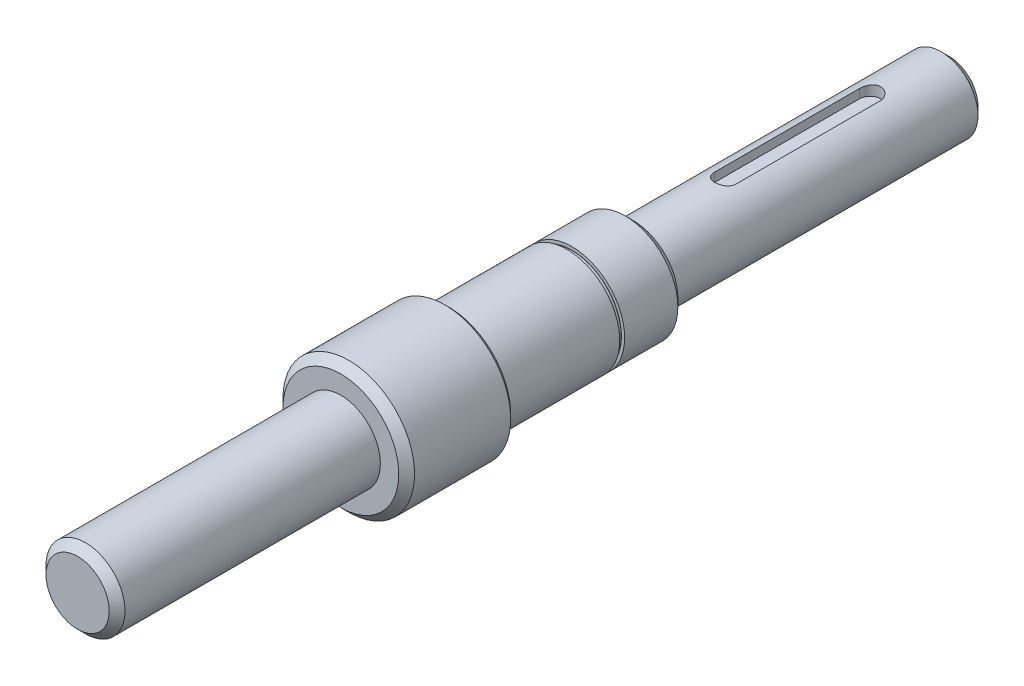
ISO-10303-21;
HEADER;
FILE_DESCRIPTION(('STEP AP214'),'2;1');
FILE_NAME('part.step','',(''),(''),'','','');
FILE_SCHEMA(('AUTOMOTIVE_DESIGN { 1 0 10303 214 1 1 1 1 }'));
ENDSEC;
DATA;
#1=APPLICATION_CONTEXT('core data for automotive mechanical design processes');
#2=APPLICATION_PROTOCOL_DEFINITION('international standard','automotive_design',2000,#1);
#3=PRODUCT_CONTEXT('',#1,'mechanical');
#4=PRODUCT('Part','Part','',(#3));
#5=PRODUCT_RELATED_PRODUCT_CATEGORY('part','',(#4));
#6=PRODUCT_DEFINITION_FORMATION('','',#4);
#7=PRODUCT_DEFINITION_CONTEXT('part definition',#1,'design');
#8=PRODUCT_DEFINITION('design','',#6,#7);
#9=PRODUCT_DEFINITION_SHAPE('','',#8);
#10=(LENGTH_UNIT() NAMED_UNIT(*) SI_UNIT(.MILLI.,.METRE.));
#11=(NAMED_UNIT(*) PLANE_ANGLE_UNIT() SI_UNIT($,.RADIAN.));
#12=(NAMED_UNIT(*) SI_UNIT($,.STERADIAN.) SOLID_ANGLE_UNIT());
#13=UNCERTAINTY_MEASURE_WITH_UNIT(LENGTH_MEASURE(1.E-05),#10,'distance_accuracy_value','');
#14=(GEOMETRIC_REPRESENTATION_CONTEXT(3) GLOBAL_UNCERTAINTY_ASSIGNED_CONTEXT((#13)) GLOBAL_UNIT_ASSIGNED_CONTEXT((#10,
#11,#12)) REPRESENTATION_CONTEXT('',''));
#15=CARTESIAN_POINT('',(0.,0.,0.));
#16=DIRECTION('',(0.,0.,1.));
#17=DIRECTION('',(1.,0.,0.));
#18=AXIS2_PLACEMENT_3D('',#15,#16,#17);
#19=CARTESIAN_POINT('',(0.,0.,0.));
#20=DIRECTION('',(0.,0.,1.));
#21=DIRECTION('',(1.,0.,0.));
#22=AXIS2_PLACEMENT_3D('',#19,#20,#21);
#23=CYLINDRICAL_SURFACE('',#22,20.);
#24=CARTESIAN_POINT('',(-8.88178419700125E-13,0.,-185.925000000001));
#25=DIRECTION('',(0.,0.,-1.));
#26=DIRECTION('',(-1.,0.,0.));
#27=AXIS2_PLACEMENT_3D('',#24,#25,#26);
#28=CIRCLE('',#27,20.);
#29=CARTESIAN_POINT('',(-20.0000000000009,0.,-185.925000000001));
#30=VERTEX_POINT('',#29);
#31=EDGE_CURVE('E130',#30,#30,#28,.T.);
#32=ORIENTED_EDGE('',*,*,#31,.F.);
#33=EDGE_LOOP('',(#32));
#34=FACE_BOUND('',#33,.T.);
#35=CARTESIAN_POINT('',(0.,0.,-141.));
#36=DIRECTION('',(0.,0.,-1.));
#37=DIRECTION('',(-1.,0.,0.));
#38=AXIS2_PLACEMENT_3D('',#35,#36,#37);
#39=CIRCLE('',#38,20.);
#40=CARTESIAN_POINT('',(-20.,0.,-141.));
#41=VERTEX_POINT('',#40);
#42=EDGE_CURVE('E112',#41,#41,#39,.T.);
#43=ORIENTED_EDGE('',*,*,#42,.T.);
#44=EDGE_LOOP('',(#43));
#45=FACE_BOUND('',#44,.T.);
#46=ADVANCED_FACE('F49',(#34,#45),#23,.T.);
#47=CARTESIAN_POINT('',(-8.88178419700125E-13,0.,-185.925000000001));
#48=DIRECTION('',(0.,0.,-1.));
#49=DIRECTION('',(-1.,0.,0.));
#50=AXIS2_PLACEMENT_3D('',#47,#48,#49);
#51=PLANE('',#50);
#52=CARTESIAN_POINT('',(-8.88178419700125E-13,0.,-185.925000000001));
#53=DIRECTION('',(0.,0.,-1.));
#54=DIRECTION('',(-1.,0.,0.));
#55=AXIS2_PLACEMENT_3D('',#52,#53,#54);
#56=CIRCLE('',#55,18.8);
#57=CARTESIAN_POINT('',(-18.8000000000009,0.,-185.925000000001));
#58=VERTEX_POINT('',#57);
#59=EDGE_CURVE('E162',#58,#58,#56,.F.);
#60=ORIENTED_EDGE('',*,*,#59,.T.);
#61=EDGE_LOOP('',(#60));
#62=FACE_BOUND('',#61,.T.);
#63=ORIENTED_EDGE('',*,*,#31,.T.);
#64=EDGE_LOOP('',(#63));
#65=FACE_BOUND('',#64,.T.);
#66=ADVANCED_FACE('F249',(#62,#65),#51,.T.);
#67=CARTESIAN_POINT('',(-4.44089209850063E-13,0.,-187.775));
#68=DIRECTION('',(0.,0.,-1.));
#69=DIRECTION('',(-1.,0.,0.));
#70=AXIS2_PLACEMENT_3D('',#67,#68,#69);
#71=PLANE('',#70);
#72=CARTESIAN_POINT('',(-4.44089209850063E-13,0.,-187.775));
#73=DIRECTION('',(0.,0.,-1.));
#74=DIRECTION('',(-1.,0.,0.));
#75=AXIS2_PLACEMENT_3D('',#72,#73,#74);
#76=CIRCLE('',#75,18.8);
#77=CARTESIAN_POINT('',(-18.8000000000004,0.,-187.775));
#78=VERTEX_POINT('',#77);
#79=EDGE_CURVE('E168',#78,#78,#76,.T.);
#80=ORIENTED_EDGE('',*,*,#79,.T.);
#81=EDGE_LOOP('',(#80));
#82=FACE_BOUND('',#81,.T.);
#83=CARTESIAN_POINT('',(-4.44089209850063E-13,0.,-187.775));
#84=DIRECTION('',(0.,0.,-1.));
#85=DIRECTION('',(-1.,0.,0.));
#86=AXIS2_PLACEMENT_3D('',#83,#84,#85);
#87=CIRCLE('',#86,20.);
#88=CARTESIAN_POINT('',(-20.0000000000004,0.,-187.775));
#89=VERTEX_POINT('',#88);
#90=EDGE_CURVE('E123',#89,#89,#87,.T.);
#91=ORIENTED_EDGE('',*,*,#90,.F.);
#92=EDGE_LOOP('',(#91));
#93=FACE_BOUND('',#92,.T.);
#94=ADVANCED_FACE('F257',(#82,#93),#71,.F.);
#95=CARTESIAN_POINT('',(-8.88178419700125E-13,0.,-185.925000000001));
#96=DIRECTION('',(0.,0.,-1.));
#97=DIRECTION('',(-1.,0.,0.));
#98=AXIS2_PLACEMENT_3D('',#95,#96,#97);
#99=CYLINDRICAL_SURFACE('',#98,18.75);
#100=CARTESIAN_POINT('',(0.,0.,-185.975));
#101=DIRECTION('',(0.,0.,-1.));
#102=DIRECTION('',(-1.,0.,0.));
#103=AXIS2_PLACEMENT_3D('',#100,#101,#102);
#104=CIRCLE('',#103,18.75);
#105=CARTESIAN_POINT('',(-18.75,0.,-185.975));
#106=VERTEX_POINT('',#105);
#107=EDGE_CURVE('E158',#106,#106,#104,.T.);
#108=ORIENTED_EDGE('',*,*,#107,.T.);
#109=EDGE_LOOP('',(#108));
#110=FACE_BOUND('',#109,.T.);
#111=CARTESIAN_POINT('',(-1.33226762955019E-12,0.,-187.725));
#112=DIRECTION('',(0.,0.,-1.));
#113=DIRECTION('',(-1.,0.,0.));
#114=AXIS2_PLACEMENT_3D('',#111,#112,#113);
#115=CIRCLE('',#114,18.75);
#116=CARTESIAN_POINT('',(-18.7500000000013,0.,-187.725));
#117=VERTEX_POINT('',#116);
#118=EDGE_CURVE('E160',#117,#117,#115,.F.);
#119=ORIENTED_EDGE('',*,*,#118,.T.);
#120=EDGE_LOOP('',(#119));
#121=FACE_BOUND('',#120,.T.);
#122=ADVANCED_FACE('F197',(#110,#121),#99,.T.);
#123=CARTESIAN_POINT('',(-2.22044604925031E-13,0.,-301.));
#124=DIRECTION('',(0.,0.,-1.));
#125=DIRECTION('',(-1.,0.,0.));
#126=AXIS2_PLACEMENT_3D('',#123,#124,#125);
#127=CONICAL_SURFACE('',#126,5.09999999999999,1.02974425867665);
#128=CARTESIAN_POINT('',(-1.55431223447522E-12,0.,-297.93561084296));
#129=VERTEX_POINT('',#128);
#130=VERTEX_LOOP('',#129);
#131=FACE_BOUND('',#130,.T.);
#132=CARTESIAN_POINT('',(-2.22044604925031E-13,0.,-301.555796072601));
#133=DIRECTION('',(0.,0.,-1.));
#134=DIRECTION('',(-1.,0.,0.));
#135=AXIS2_PLACEMENT_3D('',#132,#133,#134);
#136=CIRCLE('',#135,6.02499999999999);
#137=CARTESIAN_POINT('',(-6.02500000000022,0.,-301.555796072601));
#138=VERTEX_POINT('',#137);
#139=EDGE_CURVE('E136',#138,#138,#136,.T.);
#140=ORIENTED_EDGE('',*,*,#139,.T.);
#141=EDGE_LOOP('',(#140));
#142=FACE_BOUND('',#141,.T.);
#143=ADVANCED_FACE('F326',(#131,#142),#127,.F.);
#144=CARTESIAN_POINT('',(-4.44089209850063E-13,0.,-331.));
#145=DIRECTION('',(0.,0.,-1.));
#146=DIRECTION('',(-1.,0.,0.));
#147=AXIS2_PLACEMENT_3D('',#144,#145,#146);
#148=CYLINDRICAL_SURFACE('',#147,6.02499999999999);
#149=ORIENTED_EDGE('',*,*,#139,.F.);
#150=EDGE_LOOP('',(#149));
#151=FACE_BOUND('',#150,.T.);
#152=CARTESIAN_POINT('',(-4.44089209850063E-13,0.,-331.));
#153=DIRECTION('',(0.,0.,1.));
#154=DIRECTION('',(1.,0.,0.));
#155=AXIS2_PLACEMENT_3D('',#152,#153,#154);
#156=CIRCLE('',#155,6.02499999999999);
#157=CARTESIAN_POINT('',(6.02499999999955,0.,-331.));
#158=VERTEX_POINT('',#157);
#159=EDGE_CURVE('E53',#158,#158,#156,.F.);
#160=ORIENTED_EDGE('',*,*,#159,.T.);
#161=EDGE_LOOP('',(#160));
#162=FACE_BOUND('',#161,.T.);
#163=ADVANCED_FACE('F55',(#151,#162),#148,.F.);
#164=CARTESIAN_POINT('',(-4.44089209850063E-13,14.,-331.));
#165=DIRECTION('',(0.,0.,1.));
#166=DIRECTION('',(1.,0.,0.));
#167=AXIS2_PLACEMENT_3D('',#164,#165,#166);
#168=PLANE('',#167);
#169=ORIENTED_EDGE('',*,*,#159,.F.);
#170=EDGE_LOOP('',(#169));
#171=FACE_BOUND('',#170,.T.);
#172=CARTESIAN_POINT('',(-4.44089209850063E-13,0.,-331.));
#173=DIRECTION('',(0.,0.,1.));
#174=DIRECTION('',(1.,0.,0.));
#175=AXIS2_PLACEMENT_3D('',#172,#173,#174);
#176=CIRCLE('',#175,11.0000000000001);
#177=CARTESIAN_POINT('',(10.9999999999996,0.,-331.));
#178=VERTEX_POINT('',#177);
#179=EDGE_CURVE('E154',#178,#178,#176,.F.);
#180=ORIENTED_EDGE('',*,*,#179,.T.);
#181=EDGE_LOOP('',(#180));
#182=FACE_BOUND('',#181,.T.);
#183=ADVANCED_FACE('F222',(#171,#182),#168,.F.);
#184=CARTESIAN_POINT('',(4.44089209850063E-13,0.,-328.));
#185=DIRECTION('',(0.,0.,1.));
#186=DIRECTION('',(1.,0.,0.));
#187=AXIS2_PLACEMENT_3D('',#184,#185,#186);
#188=CONICAL_SURFACE('',#187,14.,0.785398163397451);
#189=ORIENTED_EDGE('',*,*,#179,.F.);
#190=EDGE_LOOP('',(#189));
#191=FACE_BOUND('',#190,.T.);
#192=CARTESIAN_POINT('',(4.44089209850063E-13,0.,-328.));
#193=DIRECTION('',(0.,0.,1.));
#194=DIRECTION('',(1.,0.,0.));
#195=AXIS2_PLACEMENT_3D('',#192,#193,#194);
#196=CIRCLE('',#195,14.);
#197=CARTESIAN_POINT('',(14.0000000000004,0.,-328.));
#198=VERTEX_POINT('',#197);
#199=EDGE_CURVE('E152',#198,#198,#196,.T.);
#200=ORIENTED_EDGE('',*,*,#199,.F.);
#201=EDGE_LOOP('',(#200));
#202=FACE_BOUND('',#201,.T.);
#203=ADVANCED_FACE('F224',(#191,#202),#188,.T.);
#204=CARTESIAN_POINT('',(0.,0.,0.));
#205=DIRECTION('',(0.,0.,1.));
#206=DIRECTION('',(1.,0.,0.));
#207=AXIS2_PLACEMENT_3D('',#204,#205,#206);
#208=CYLINDRICAL_SURFACE('',#207,14.);
#209=DIRECTION('',(0.,0.,1.));
#210=VECTOR('',#209,1.);
#211=CARTESIAN_POINT('',(-4.00000000000089,13.4164078649987,0.));
#212=LINE('',#211,#210);
#213=CARTESIAN_POINT('',(-4.,13.4164078649987,-246.));
#214=VERTEX_POINT('',#213);
#215=CARTESIAN_POINT('',(-4.00000000000045,13.4164078649987,-301.));
#216=VERTEX_POINT('',#215);
#217=EDGE_CURVE('E179',#214,#216,#212,.F.);
#218=ORIENTED_EDGE('',*,*,#217,.T.);
#219=CARTESIAN_POINT('',(-4.00000000000045,13.4164078649987,-301.));
#220=CARTESIAN_POINT('',(-4.00001343425034,13.4163934343761,-301.110036938265));
#221=CARTESIAN_POINT('',(-3.99545969267203,13.4177612657012,-301.220065459873));
#222=CARTESIAN_POINT('',(-3.97732232122,13.4231542734791,-301.439287989373));
#223=CARTESIAN_POINT('',(-3.96374056380179,13.4271788988985,-301.548482165565));
#224=CARTESIAN_POINT('',(-3.92769415038625,13.4377658850056,-301.765008682583));
#225=CARTESIAN_POINT('',(-3.90525054418338,13.4443222312195,-301.872344810754));
#226=CARTESIAN_POINT('',(-3.85169716990218,13.4597622573631,-302.084633002555));
#227=CARTESIAN_POINT('',(-3.82058720850019,13.4686459892104,-302.189585012944));
#228=CARTESIAN_POINT('',(-3.71462722105326,13.4984072106129,-302.499717642999));
#229=CARTESIAN_POINT('',(-3.62710377190582,13.522408265187,-302.700432400309));
#230=CARTESIAN_POINT('',(-3.42099335445606,13.5760110031015,-303.084316862068));
#231=CARTESIAN_POINT('',(-3.30239378136389,13.6056149576786,-303.267479405898));
#232=CARTESIAN_POINT('',(-3.03385514387223,13.6680345915528,-303.616369404888));
#233=CARTESIAN_POINT('',(-2.88318637668641,13.7009134336829,-303.781525020061));
#234=CARTESIAN_POINT('',(-2.55635049218731,13.765637836017,-304.084601355981));
#235=CARTESIAN_POINT('',(-2.38017915468921,13.7974832241343,-304.222517560181));
#236=CARTESIAN_POINT('',(-2.00328797864476,13.8572672913437,-304.46965938831));
#237=CARTESIAN_POINT('',(-1.80217262010893,13.885122326296,-304.578303905581));
#238=CARTESIAN_POINT('',(-1.38360719231159,13.9330517158676,-304.760007003574));
#239=CARTESIAN_POINT('',(-1.16616104383842,13.9531279309861,-304.833074094601));
#240=CARTESIAN_POINT('',(-0.727119470413206,13.9827902284191,-304.939668316764));
#241=CARTESIAN_POINT('',(-0.505780313917118,13.9926363331616,-304.974177311462));
#242=CARTESIAN_POINT('',(-0.060244963314461,14.0016419286283,-305.005773527506));
#243=CARTESIAN_POINT('',(0.163950738693234,14.0008032358133,-305.002867109631));
#244=CARTESIAN_POINT('',(0.601961495842456,13.9887201082302,-304.960387183875));
#245=CARTESIAN_POINT('',(0.815889248065166,13.9777773149304,-304.921876540054));
#246=CARTESIAN_POINT('',(1.2341066368743,13.9470775079523,-304.811008876966));
#247=CARTESIAN_POINT('',(1.43839578630372,13.9273200492871,-304.738650148952));
#248=CARTESIAN_POINT('',(1.83414901693127,13.8807804985664,-304.561381109693));
#249=CARTESIAN_POINT('',(2.02544821255078,13.8539238723962,-304.456123112831));
#250=CARTESIAN_POINT('',(2.38801825134902,13.7960546774322,-304.216306263055));
#251=CARTESIAN_POINT('',(2.55928501856316,13.7650412656094,-304.08174146302));
#252=CARTESIAN_POINT('',(2.8832448539864,13.7009177251594,-303.781613203088));
#253=CARTESIAN_POINT('',(3.03507809123968,13.6677722027514,-303.615129667491));
#254=CARTESIAN_POINT('',(3.30897556854497,13.6040627781026,-303.258573557127));
#255=CARTESIAN_POINT('',(3.43103136574909,13.5734996096428,-303.068494315225));
#256=CARTESIAN_POINT('',(3.589453381569,13.53214050168,-302.768841328101));
#257=CARTESIAN_POINT('',(3.63832313759582,13.5190503394642,-302.666010156567));
#258=CARTESIAN_POINT('',(3.72718558969926,13.4948216745031,-302.456373741282));
#259=CARTESIAN_POINT('',(3.7671818903245,13.4836823796711,-302.349570131866));
#260=CARTESIAN_POINT('',(3.83791732102454,13.4637194613748,-302.132861334789));
#261=CARTESIAN_POINT('',(3.86866612224672,13.4548934199326,-302.022959519801));
#262=CARTESIAN_POINT('',(3.92067829243109,13.4398293634313,-301.800804060039));
#263=CARTESIAN_POINT('',(3.94194605597013,13.4335901494402,-301.688551530165));
#264=CARTESIAN_POINT('',(3.97223001063502,13.4246640965205,-301.480267797862));
#265=CARTESIAN_POINT('',(3.98264484818179,13.4215735027149,-301.384454640876));
#266=CARTESIAN_POINT('',(3.99652828144927,13.4174428037404,-301.192430219405));
#267=CARTESIAN_POINT('',(4.00000747148526,13.4163995712315,-301.096219787408));
#268=CARTESIAN_POINT('',(3.99999999999956,13.4164078649987,-301.));
#269=B_SPLINE_CURVE_WITH_KNOTS('',3,(#219,#220,#221,#222,#223,#224,#225,#226,#227,#228,#229,
#230,#231,#232,#233,#234,#235,#236,#237,#238,#239,#240,#241,#242,#243,#244,#245,#246,#247,#248,
#249,#250,#251,#252,#253,#254,#255,#256,#257,#258,#259,#260,#261,#262,#263,#264,#265,#266,#267,
#268),.UNSPECIFIED.,.F.,.F.,(4,2,2,2,2,2,2,2,2,2,2,2,2,2,2,2,2,2,2,2,2,2,2,2,4),(0.,
0.329993743044275,0.659919065086931,0.989065375850618,1.31821902959341,1.97575167696663,
2.63355144018847,3.30832474645423,3.98320984263855,4.67064278038896,5.3579111997365,
6.02724874934563,6.69647251025227,7.34634193868193,7.99624417788791,8.6532612048746,
9.31041168231899,9.99056134493355,10.6709036279949,11.0143588121207,11.3576742224051,
11.7006293306199,12.0434253092467,12.3324405185769,12.6210139131119),.UNSPECIFIED.);
#270=CARTESIAN_POINT('',(3.99999999999956,13.4164078649987,-301.));
#271=VERTEX_POINT('',#270);
#272=EDGE_CURVE('E201',#216,#271,#269,.T.);
#273=ORIENTED_EDGE('',*,*,#272,.T.);
#274=DIRECTION('',(0.,0.,1.));
#275=VECTOR('',#274,1.);
#276=CARTESIAN_POINT('',(3.99999999999889,13.4164078649987,-4.44089209850063E-13));
#277=LINE('',#276,#275);
#278=CARTESIAN_POINT('',(3.99999999999845,13.4164078649987,-246.000000000001));
#279=VERTEX_POINT('',#278);
#280=EDGE_CURVE('E97',#271,#279,#277,.T.);
#281=ORIENTED_EDGE('',*,*,#280,.T.);
#282=CARTESIAN_POINT('',(3.99999999999845,13.4164078649987,-246.000000000001));
#283=CARTESIAN_POINT('',(4.00001343424734,13.4163934343769,-245.889963061736));
#284=CARTESIAN_POINT('',(3.99545969266876,13.4177612657021,-245.779934540128));
#285=CARTESIAN_POINT('',(3.97732232121666,13.4231542734802,-245.560712010627));
#286=CARTESIAN_POINT('',(3.96374056379862,13.4271788988994,-245.451517834436));
#287=CARTESIAN_POINT('',(3.92769415038283,13.4377658850066,-245.234991317418));
#288=CARTESIAN_POINT('',(3.90525054417954,13.4443222312207,-245.127655189247));
#289=CARTESIAN_POINT('',(3.85169716989944,13.4597622573638,-244.915366997446));
#290=CARTESIAN_POINT('',(3.82058720849898,13.4686459892105,-244.810414987056));
#291=CARTESIAN_POINT('',(3.71462722105361,13.4984072106124,-244.500282357001));
#292=CARTESIAN_POINT('',(3.62710377190325,13.5224082651876,-244.299567599693));
#293=CARTESIAN_POINT('',(3.42099335445253,13.5760110031024,-243.915683137933));
#294=CARTESIAN_POINT('',(3.30239378136231,13.6056149576788,-243.732520594102));
#295=CARTESIAN_POINT('',(3.03385514387127,13.6680345915526,-243.383630595112));
#296=CARTESIAN_POINT('',(2.88318637668406,13.7009134336834,-243.21847497994));
#297=CARTESIAN_POINT('',(2.5563504921848,13.7656378360175,-242.91539864402));
#298=CARTESIAN_POINT('',(2.38017915468795,13.7974832241344,-242.777482439819));
#299=CARTESIAN_POINT('',(2.0032879786442,13.8572672913436,-242.53034061169));
#300=CARTESIAN_POINT('',(1.80217262010777,13.8851223262961,-242.42169609442));
#301=CARTESIAN_POINT('',(1.38360719231028,13.9330517158678,-242.239992996427));
#302=CARTESIAN_POINT('',(1.16616104383755,13.9531279309862,-242.1669259054));
#303=CARTESIAN_POINT('',(0.727119470412402,13.9827902284191,-242.060331683236));
#304=CARTESIAN_POINT('',(0.50578031391593,13.9926363331616,-242.025822688539));
#305=CARTESIAN_POINT('',(0.0602449633126955,14.0016419286283,-241.994226472495));
#306=CARTESIAN_POINT('',(-0.163950738695193,14.0008032358133,-241.997132890369));
#307=CARTESIAN_POINT('',(-0.601961495844389,13.9887201082301,-242.039612816126));
#308=CARTESIAN_POINT('',(-0.815889248066885,13.9777773149303,-242.078123459946));
#309=CARTESIAN_POINT('',(-1.23410663687534,13.9470775079522,-242.188991123034));
#310=CARTESIAN_POINT('',(-1.4383957863043,13.9273200492871,-242.261349851049));
#311=CARTESIAN_POINT('',(-1.8341490169321,13.8807804985663,-242.438618890307));
#312=CARTESIAN_POINT('',(-2.02544821255229,13.8539238723958,-242.543876887169));
#313=CARTESIAN_POINT('',(-2.38801825135095,13.796054677432,-242.783693736945));
#314=CARTESIAN_POINT('',(-2.55928501856484,13.7650412656095,-242.918258536981));
#315=CARTESIAN_POINT('',(-2.88324485398849,13.7009177251593,-243.218386796913));
#316=CARTESIAN_POINT('',(-3.0350780912425,13.6677722027507,-243.384870332509));
#317=CARTESIAN_POINT('',(-3.30897556854741,13.6040627781021,-243.741426442873));
#318=CARTESIAN_POINT('',(-3.43103136575041,13.5734996096431,-243.931505684775));
#319=CARTESIAN_POINT('',(-3.58945338157107,13.5321405016799,-244.231158671899));
#320=CARTESIAN_POINT('',(-3.63832313759858,13.5190503394635,-244.333989843433));
#321=CARTESIAN_POINT('',(-3.7271855897025,13.4948216745021,-244.543626258718));
#322=CARTESIAN_POINT('',(-3.76718189032755,13.4836823796702,-244.650429868134));
#323=CARTESIAN_POINT('',(-3.83791732102773,13.4637194613739,-244.867138665211));
#324=CARTESIAN_POINT('',(-3.86866612225026,13.4548934199314,-244.977040480199));
#325=CARTESIAN_POINT('',(-3.92067829243396,13.4398293634306,-245.199195939961));
#326=CARTESIAN_POINT('',(-3.94194605597197,13.4335901494402,-245.311448469836));
#327=CARTESIAN_POINT('',(-3.97223001063713,13.4246640965204,-245.519732202138));
#328=CARTESIAN_POINT('',(-3.98264484818484,13.4215735027142,-245.615545359124));
#329=CARTESIAN_POINT('',(-3.99652828145283,13.4174428037392,-245.807569780596));
#330=CARTESIAN_POINT('',(-4.00000747148838,13.4163995712302,-245.903780212592));
#331=CARTESIAN_POINT('',(-4.,13.4164078649987,-246.));
#332=B_SPLINE_CURVE_WITH_KNOTS('',3,(#282,#283,#284,#285,#286,#287,#288,#289,#290,#291,#292,
#293,#294,#295,#296,#297,#298,#299,#300,#301,#302,#303,#304,#305,#306,#307,#308,#309,#310,#311,
#312,#313,#314,#315,#316,#317,#318,#319,#320,#321,#322,#323,#324,#325,#326,#327,#328,#329,#330,
#331),.UNSPECIFIED.,.F.,.F.,(4,2,2,2,2,2,2,2,2,2,2,2,2,2,2,2,2,2,2,2,2,2,2,2,4),(0.,
0.329993743043924,0.659919065086829,0.989065375850595,1.31821902959306,1.97575167696643,
2.63355144018842,3.30832474645373,3.98320984263756,4.67064278038763,5.35791119973493,
6.02724874934484,6.69647251025221,7.34634193868096,7.99624417788608,8.65326120487365,
9.31041168231883,9.99056134493323,10.6709036279944,11.0143588121206,11.3576742224051,
11.70062933062,12.0434253092471,12.332440518577,12.621013913112),.UNSPECIFIED.);
#333=EDGE_CURVE('E167',#279,#214,#332,.T.);
#334=ORIENTED_EDGE('',*,*,#333,.T.);
#335=EDGE_LOOP('',(#218,#273,#281,#334));
#336=FACE_BOUND('',#335,.T.);
#337=ORIENTED_EDGE('',*,*,#199,.T.);
#338=EDGE_LOOP('',(#337));
#339=FACE_BOUND('',#338,.T.);
#340=CARTESIAN_POINT('',(-2.22044604925031E-13,0.,-211.));
#341=DIRECTION('',(0.,0.,1.));
#342=DIRECTION('',(1.,0.,0.));
#343=AXIS2_PLACEMENT_3D('',#340,#341,#342);
#344=CIRCLE('',#343,14.);
#345=CARTESIAN_POINT('',(13.9999999999998,0.,-211.));
#346=VERTEX_POINT('',#345);
#347=EDGE_CURVE('E135',#346,#346,#344,.T.);
#348=ORIENTED_EDGE('',*,*,#347,.F.);
#349=EDGE_LOOP('',(#348));
#350=FACE_BOUND('',#349,.T.);
#351=ADVANCED_FACE('F183',(#336,#339,#350),#208,.T.);
#352=CARTESIAN_POINT('',(-1.99840144432528E-12,20.,-211.000000000001));
#353=DIRECTION('',(0.,0.,1.));
#354=DIRECTION('',(1.,0.,0.));
#355=AXIS2_PLACEMENT_3D('',#352,#353,#354);
#356=PLANE('',#355);
#357=CARTESIAN_POINT('',(-2.22044604925031E-13,0.,-211.));
#358=DIRECTION('',(0.,0.,1.));
#359=DIRECTION('',(1.,0.,0.));
#360=AXIS2_PLACEMENT_3D('',#357,#358,#359);
#361=CIRCLE('',#360,17.0000000000001);
#362=CARTESIAN_POINT('',(16.9999999999998,0.,-211.));
#363=VERTEX_POINT('',#362);
#364=EDGE_CURVE('E12',#363,#363,#361,.F.);
#365=ORIENTED_EDGE('',*,*,#364,.T.);
#366=EDGE_LOOP('',(#365));
#367=FACE_BOUND('',#366,.T.);
#368=ORIENTED_EDGE('',*,*,#347,.T.);
#369=EDGE_LOOP('',(#368));
#370=FACE_BOUND('',#369,.T.);
#371=ADVANCED_FACE('F234',(#367,#370),#356,.F.);
#372=CARTESIAN_POINT('',(-2.22044604925031E-13,0.,-208.));
#373=DIRECTION('',(0.,0.,1.));
#374=DIRECTION('',(1.,0.,0.));
#375=AXIS2_PLACEMENT_3D('',#372,#373,#374);
#376=CIRCLE('',#375,20.);
#377=CARTESIAN_POINT('',(19.9999999999998,0.,-208.));
#378=VERTEX_POINT('',#377);
#379=EDGE_CURVE('E56',#378,#378,#376,.T.);
#380=ORIENTED_EDGE('',*,*,#379,.T.);
#381=EDGE_LOOP('',(#380));
#382=FACE_BOUND('',#381,.T.);
#383=ORIENTED_EDGE('',*,*,#90,.T.);
#384=EDGE_LOOP('',(#383));
#385=FACE_BOUND('',#384,.T.);
#386=ADVANCED_FACE('F238',(#382,#385),#23,.T.);
#387=CARTESIAN_POINT('',(0.,0.,-185.975));
#388=DIRECTION('',(0.,0.,-1.));
#389=DIRECTION('',(-1.,0.,0.));
#390=AXIS2_PLACEMENT_3D('',#387,#388,#389);
#391=TOROIDAL_SURFACE('',#390,18.8,0.05);
#392=ORIENTED_EDGE('',*,*,#59,.F.);
#393=EDGE_LOOP('',(#392));
#394=FACE_BOUND('',#393,.T.);
#395=ORIENTED_EDGE('',*,*,#107,.F.);
#396=EDGE_LOOP('',(#395));
#397=FACE_BOUND('',#396,.T.);
#398=ADVANCED_FACE('F242',(#394,#397),#391,.F.);
#399=CARTESIAN_POINT('',(-1.33226762955019E-12,0.,-187.725));
#400=DIRECTION('',(0.,0.,-1.));
#401=DIRECTION('',(-1.,0.,0.));
#402=AXIS2_PLACEMENT_3D('',#399,#400,#401);
#403=TOROIDAL_SURFACE('',#402,18.8,0.05);
#404=ORIENTED_EDGE('',*,*,#118,.F.);
#405=EDGE_LOOP('',(#404));
#406=FACE_BOUND('',#405,.T.);
#407=ORIENTED_EDGE('',*,*,#79,.F.);
#408=EDGE_LOOP('',(#407));
#409=FACE_BOUND('',#408,.T.);
#410=ADVANCED_FACE('F198',(#406,#409),#403,.F.);
#411=CARTESIAN_POINT('',(-2.88657986402541E-12,25.,-301.000000000001));
#412=DIRECTION('',(0.,-1.,0.));
#413=DIRECTION('',(0.,0.,-1.));
#414=AXIS2_PLACEMENT_3D('',#411,#412,#413);
#415=CYLINDRICAL_SURFACE('',#414,4.);
#416=DIRECTION('',(0.,-1.,0.));
#417=VECTOR('',#416,1.);
#418=CARTESIAN_POINT('',(-4.00000000000045,24.9999999999999,-301.));
#419=LINE('',#418,#417);
#420=CARTESIAN_POINT('',(-4.00000000000045,9.99999999999994,-301.));
#421=VERTEX_POINT('',#420);
#422=EDGE_CURVE('E114',#216,#421,#419,.T.);
#423=ORIENTED_EDGE('',*,*,#422,.T.);
#424=CARTESIAN_POINT('',(-2.22044604925031E-13,10.,-301.));
#425=DIRECTION('',(0.,-1.,0.));
#426=DIRECTION('',(0.,0.,-1.));
#427=AXIS2_PLACEMENT_3D('',#424,#425,#426);
#428=CIRCLE('',#427,4.);
#429=CARTESIAN_POINT('',(3.99999999999956,10.,-301.));
#430=VERTEX_POINT('',#429);
#431=EDGE_CURVE('E107',#421,#430,#428,.T.);
#432=ORIENTED_EDGE('',*,*,#431,.T.);
#433=DIRECTION('',(0.,-1.,0.));
#434=VECTOR('',#433,1.);
#435=CARTESIAN_POINT('',(3.99999999999934,25.,-301.));
#436=LINE('',#435,#434);
#437=EDGE_CURVE('E93',#271,#430,#436,.T.);
#438=ORIENTED_EDGE('',*,*,#437,.F.);
#439=ORIENTED_EDGE('',*,*,#272,.F.);
#440=EDGE_LOOP('',(#423,#432,#438,#439));
#441=FACE_BOUND('',#440,.T.);
#442=ADVANCED_FACE('F115',(#441),#415,.F.);
#443=CARTESIAN_POINT('',(-4.00000000000045,24.9999999999999,-301.));
#444=DIRECTION('',(-1.,0.,0.));
#445=DIRECTION('',(0.,0.,1.));
#446=AXIS2_PLACEMENT_3D('',#443,#444,#445);
#447=PLANE('',#446);
#448=DIRECTION('',(0.,-1.,0.));
#449=VECTOR('',#448,1.);
#450=CARTESIAN_POINT('',(-4.,25.,-246.));
#451=LINE('',#450,#449);
#452=CARTESIAN_POINT('',(-4.,10.,-246.));
#453=VERTEX_POINT('',#452);
#454=EDGE_CURVE('E122',#214,#453,#451,.T.);
#455=ORIENTED_EDGE('',*,*,#454,.T.);
#456=DIRECTION('',(0.,0.,-1.));
#457=VECTOR('',#456,1.);
#458=CARTESIAN_POINT('',(-4.00000000000045,9.99999999999994,-301.));
#459=LINE('',#458,#457);
#460=EDGE_CURVE('E96',#453,#421,#459,.T.);
#461=ORIENTED_EDGE('',*,*,#460,.T.);
#462=ORIENTED_EDGE('',*,*,#422,.F.);
#463=ORIENTED_EDGE('',*,*,#217,.F.);
#464=EDGE_LOOP('',(#455,#461,#462,#463));
#465=FACE_BOUND('',#464,.T.);
#466=ADVANCED_FACE('F187',(#465),#447,.F.);
#467=CARTESIAN_POINT('',(-4.44089209850063E-13,25.0000000000001,-246.));
#468=DIRECTION('',(0.,-1.,0.));
#469=DIRECTION('',(0.,0.,-1.));
#470=AXIS2_PLACEMENT_3D('',#467,#468,#469);
#471=CYLINDRICAL_SURFACE('',#470,4.);
#472=DIRECTION('',(0.,-1.,0.));
#473=VECTOR('',#472,1.);
#474=CARTESIAN_POINT('',(3.99999999999956,25.,-246.));
#475=LINE('',#474,#473);
#476=CARTESIAN_POINT('',(3.99999999999845,10.,-246.000000000001));
#477=VERTEX_POINT('',#476);
#478=EDGE_CURVE('E70',#279,#477,#475,.T.);
#479=ORIENTED_EDGE('',*,*,#478,.T.);
#480=CARTESIAN_POINT('',(-4.44089209850063E-13,10.,-246.));
#481=DIRECTION('',(0.,-1.,0.));
#482=DIRECTION('',(0.,0.,-1.));
#483=AXIS2_PLACEMENT_3D('',#480,#481,#482);
#484=CIRCLE('',#483,4.);
#485=EDGE_CURVE('E109',#477,#453,#484,.T.);
#486=ORIENTED_EDGE('',*,*,#485,.T.);
#487=ORIENTED_EDGE('',*,*,#454,.F.);
#488=ORIENTED_EDGE('',*,*,#333,.F.);
#489=EDGE_LOOP('',(#479,#486,#487,#488));
#490=FACE_BOUND('',#489,.T.);
#491=ADVANCED_FACE('F184',(#490),#471,.F.);
#492=CARTESIAN_POINT('',(3.99999999999934,25.,-301.));
#493=DIRECTION('',(1.,0.,0.));
#494=DIRECTION('',(0.,0.,-1.));
#495=AXIS2_PLACEMENT_3D('',#492,#493,#494);
#496=PLANE('',#495);
#497=ORIENTED_EDGE('',*,*,#437,.T.);
#498=DIRECTION('',(0.,0.,1.));
#499=VECTOR('',#498,1.);
#500=CARTESIAN_POINT('',(3.99999999999956,10.,-301.));
#501=LINE('',#500,#499);
#502=EDGE_CURVE('E94',#430,#477,#501,.T.);
#503=ORIENTED_EDGE('',*,*,#502,.T.);
#504=ORIENTED_EDGE('',*,*,#478,.F.);
#505=ORIENTED_EDGE('',*,*,#280,.F.);
#506=EDGE_LOOP('',(#497,#503,#504,#505));
#507=FACE_BOUND('',#506,.T.);
#508=ADVANCED_FACE('F91',(#507),#496,.F.);
#509=CARTESIAN_POINT('',(-2.22044604925031E-13,10.,-301.));
#510=DIRECTION('',(0.,-1.,0.));
#511=DIRECTION('',(0.,0.,-1.));
#512=AXIS2_PLACEMENT_3D('',#509,#510,#511);
#513=PLANE('',#512);
#514=ORIENTED_EDGE('',*,*,#431,.F.);
#515=ORIENTED_EDGE('',*,*,#460,.F.);
#516=ORIENTED_EDGE('',*,*,#485,.F.);
#517=ORIENTED_EDGE('',*,*,#502,.F.);
#518=EDGE_LOOP('',(#514,#515,#516,#517));
#519=FACE_BOUND('',#518,.T.);
#520=ADVANCED_FACE('F101',(#519),#513,.F.);
#521=CARTESIAN_POINT('',(0.,0.,-141.));
#522=DIRECTION('',(0.,0.,-1.));
#523=DIRECTION('',(-1.,0.,0.));
#524=AXIS2_PLACEMENT_3D('',#521,#522,#523);
#525=PLANE('',#524);
#526=CARTESIAN_POINT('',(0.,0.,-141.));
#527=DIRECTION('',(0.,0.,-1.));
#528=DIRECTION('',(-1.,0.,0.));
#529=AXIS2_PLACEMENT_3D('',#526,#527,#528);
#530=CIRCLE('',#529,23.5);
#531=CARTESIAN_POINT('',(-23.5,0.,-141.));
#532=VERTEX_POINT('',#531);
#533=EDGE_CURVE('E210',#532,#532,#530,.T.);
#534=ORIENTED_EDGE('',*,*,#533,.T.);
#535=EDGE_LOOP('',(#534));
#536=FACE_BOUND('',#535,.T.);
#537=ORIENTED_EDGE('',*,*,#42,.F.);
#538=EDGE_LOOP('',(#537));
#539=FACE_BOUND('',#538,.T.);
#540=ADVANCED_FACE('F279',(#536,#539),#525,.T.);
#541=CARTESIAN_POINT('',(0.,0.,0.));
#542=DIRECTION('',(0.,0.,-1.));
#543=DIRECTION('',(-1.,0.,0.));
#544=AXIS2_PLACEMENT_3D('',#541,#542,#543);
#545=PLANE('',#544);
#546=CARTESIAN_POINT('',(0.,0.,0.));
#547=DIRECTION('',(0.,0.,-1.));
#548=DIRECTION('',(-1.,0.,0.));
#549=AXIS2_PLACEMENT_3D('',#546,#547,#548);
#550=CIRCLE('',#549,12.);
#551=CARTESIAN_POINT('',(-12.,0.,0.));
#552=VERTEX_POINT('',#551);
#553=EDGE_CURVE('E142',#552,#552,#550,.F.);
#554=ORIENTED_EDGE('',*,*,#553,.T.);
#555=EDGE_LOOP('',(#554));
#556=FACE_BOUND('',#555,.T.);
#557=ADVANCED_FACE('F280',(#556),#545,.F.);
#558=CARTESIAN_POINT('',(0.,0.,0.));
#559=DIRECTION('',(0.,0.,-1.));
#560=DIRECTION('',(-1.,0.,0.));
#561=AXIS2_PLACEMENT_3D('',#558,#559,#560);
#562=CONICAL_SURFACE('',#561,12.,0.785398163397449);
#563=CARTESIAN_POINT('',(-2.22044604925031E-13,0.,-3.00000000000011));
#564=DIRECTION('',(0.,0.,-1.));
#565=DIRECTION('',(-1.,0.,0.));
#566=AXIS2_PLACEMENT_3D('',#563,#564,#565);
#567=CIRCLE('',#566,15.);
#568=CARTESIAN_POINT('',(-15.0000000000002,0.,-3.00000000000011));
#569=VERTEX_POINT('',#568);
#570=EDGE_CURVE('E148',#569,#569,#567,.T.);
#571=ORIENTED_EDGE('',*,*,#570,.F.);
#572=EDGE_LOOP('',(#571));
#573=FACE_BOUND('',#572,.T.);
#574=ORIENTED_EDGE('',*,*,#553,.F.);
#575=EDGE_LOOP('',(#574));
#576=FACE_BOUND('',#575,.T.);
#577=ADVANCED_FACE('F274',(#573,#576),#562,.T.);
#578=CARTESIAN_POINT('',(0.,0.,0.));
#579=DIRECTION('',(0.,0.,1.));
#580=DIRECTION('',(1.,0.,0.));
#581=AXIS2_PLACEMENT_3D('',#578,#579,#580);
#582=CYLINDRICAL_SURFACE('',#581,15.);
#583=ORIENTED_EDGE('',*,*,#570,.T.);
#584=EDGE_LOOP('',(#583));
#585=FACE_BOUND('',#584,.T.);
#586=CARTESIAN_POINT('',(-2.22044604925031E-13,0.,-100.));
#587=DIRECTION('',(0.,0.,1.));
#588=DIRECTION('',(1.,0.,0.));
#589=AXIS2_PLACEMENT_3D('',#586,#587,#588);
#590=CIRCLE('',#589,15.);
#591=CARTESIAN_POINT('',(14.9999999999998,0.,-100.));
#592=VERTEX_POINT('',#591);
#593=EDGE_CURVE('E133',#592,#592,#590,.T.);
#594=ORIENTED_EDGE('',*,*,#593,.T.);
#595=EDGE_LOOP('',(#594));
#596=FACE_BOUND('',#595,.T.);
#597=ADVANCED_FACE('F271',(#585,#596),#582,.T.);
#598=CARTESIAN_POINT('',(-2.22044604925031E-13,15.0000000000001,-100.));
#599=DIRECTION('',(0.,0.,-1.));
#600=DIRECTION('',(-1.,0.,0.));
#601=AXIS2_PLACEMENT_3D('',#598,#599,#600);
#602=PLANE('',#601);
#603=CARTESIAN_POINT('',(-2.22044604925031E-13,0.,-100.));
#604=DIRECTION('',(0.,0.,-1.));
#605=DIRECTION('',(-1.,0.,0.));
#606=AXIS2_PLACEMENT_3D('',#603,#604,#605);
#607=CIRCLE('',#606,22.);
#608=CARTESIAN_POINT('',(-22.0000000000003,0.,-100.));
#609=VERTEX_POINT('',#608);
#610=EDGE_CURVE('E138',#609,#609,#607,.F.);
#611=ORIENTED_EDGE('',*,*,#610,.T.);
#612=EDGE_LOOP('',(#611));
#613=FACE_BOUND('',#612,.T.);
#614=ORIENTED_EDGE('',*,*,#593,.F.);
#615=EDGE_LOOP('',(#614));
#616=FACE_BOUND('',#615,.T.);
#617=ADVANCED_FACE('F268',(#613,#616),#602,.F.);
#618=CARTESIAN_POINT('',(-2.22044604925031E-13,0.,-100.));
#619=DIRECTION('',(0.,0.,-1.));
#620=DIRECTION('',(-1.,0.,0.));
#621=AXIS2_PLACEMENT_3D('',#618,#619,#620);
#622=CONICAL_SURFACE('',#621,22.,0.785398163397443);
#623=CARTESIAN_POINT('',(0.,0.,-103.));
#624=DIRECTION('',(0.,0.,-1.));
#625=DIRECTION('',(-1.,0.,0.));
#626=AXIS2_PLACEMENT_3D('',#623,#624,#625);
#627=CIRCLE('',#626,25.);
#628=CARTESIAN_POINT('',(-25.,0.,-103.));
#629=VERTEX_POINT('',#628);
#630=EDGE_CURVE('E145',#629,#629,#627,.T.);
#631=ORIENTED_EDGE('',*,*,#630,.F.);
#632=EDGE_LOOP('',(#631));
#633=FACE_BOUND('',#632,.T.);
#634=ORIENTED_EDGE('',*,*,#610,.F.);
#635=EDGE_LOOP('',(#634));
#636=FACE_BOUND('',#635,.T.);
#637=ADVANCED_FACE('F266',(#633,#636),#622,.T.);
#638=CARTESIAN_POINT('',(0.,0.,0.));
#639=DIRECTION('',(0.,0.,1.));
#640=DIRECTION('',(1.,0.,0.));
#641=AXIS2_PLACEMENT_3D('',#638,#639,#640);
#642=CYLINDRICAL_SURFACE('',#641,25.);
#643=CARTESIAN_POINT('',(0.,0.,-139.5));
#644=DIRECTION('',(0.,0.,-1.));
#645=DIRECTION('',(-1.,0.,0.));
#646=AXIS2_PLACEMENT_3D('',#643,#644,#645);
#647=CIRCLE('',#646,25.);
#648=CARTESIAN_POINT('',(-25.,0.,-139.5));
#649=VERTEX_POINT('',#648);
#650=EDGE_CURVE('E208',#649,#649,#647,.F.);
#651=ORIENTED_EDGE('',*,*,#650,.T.);
#652=EDGE_LOOP('',(#651));
#653=FACE_BOUND('',#652,.T.);
#654=ORIENTED_EDGE('',*,*,#630,.T.);
#655=EDGE_LOOP('',(#654));
#656=FACE_BOUND('',#655,.T.);
#657=ADVANCED_FACE('F265',(#653,#656),#642,.T.);
#658=CARTESIAN_POINT('',(0.,0.,-141.));
#659=DIRECTION('',(0.,0.,1.));
#660=DIRECTION('',(1.,0.,0.));
#661=AXIS2_PLACEMENT_3D('',#658,#659,#660);
#662=CONICAL_SURFACE('',#661,23.5,0.785398163397431);
#663=ORIENTED_EDGE('',*,*,#650,.F.);
#664=EDGE_LOOP('',(#663));
#665=FACE_BOUND('',#664,.T.);
#666=ORIENTED_EDGE('',*,*,#533,.F.);
#667=EDGE_LOOP('',(#666));
#668=FACE_BOUND('',#667,.T.);
#669=ADVANCED_FACE('F262',(#665,#668),#662,.T.);
#670=CARTESIAN_POINT('',(-2.22044604925031E-13,0.,-208.));
#671=DIRECTION('',(0.,0.,1.));
#672=DIRECTION('',(1.,0.,0.));
#673=AXIS2_PLACEMENT_3D('',#670,#671,#672);
#674=CONICAL_SURFACE('',#673,20.,0.785398163397446);
#675=ORIENTED_EDGE('',*,*,#364,.F.);
#676=EDGE_LOOP('',(#675));
#677=FACE_BOUND('',#676,.T.);
#678=ORIENTED_EDGE('',*,*,#379,.F.);
#679=EDGE_LOOP('',(#678));
#680=FACE_BOUND('',#679,.T.);
#681=ADVANCED_FACE('F306',(#677,#680),#674,.T.);
#682=CLOSED_SHELL('',(#46,#66,#94,#122,#143,#163,#183,#203,#351,#371,#386,#398,#410,#442,#466,
#491,#508,#520,#540,#557,#577,#597,#617,#637,#657,#669,#681));
#683=MANIFOLD_SOLID_BREP('B2',#682);
#684=ADVANCED_BREP_SHAPE_REPRESENTATION('',(#18,#683),#14);
#685=SHAPE_DEFINITION_REPRESENTATION(#9,#684);
ENDSEC;
END-ISO-10303-21;
